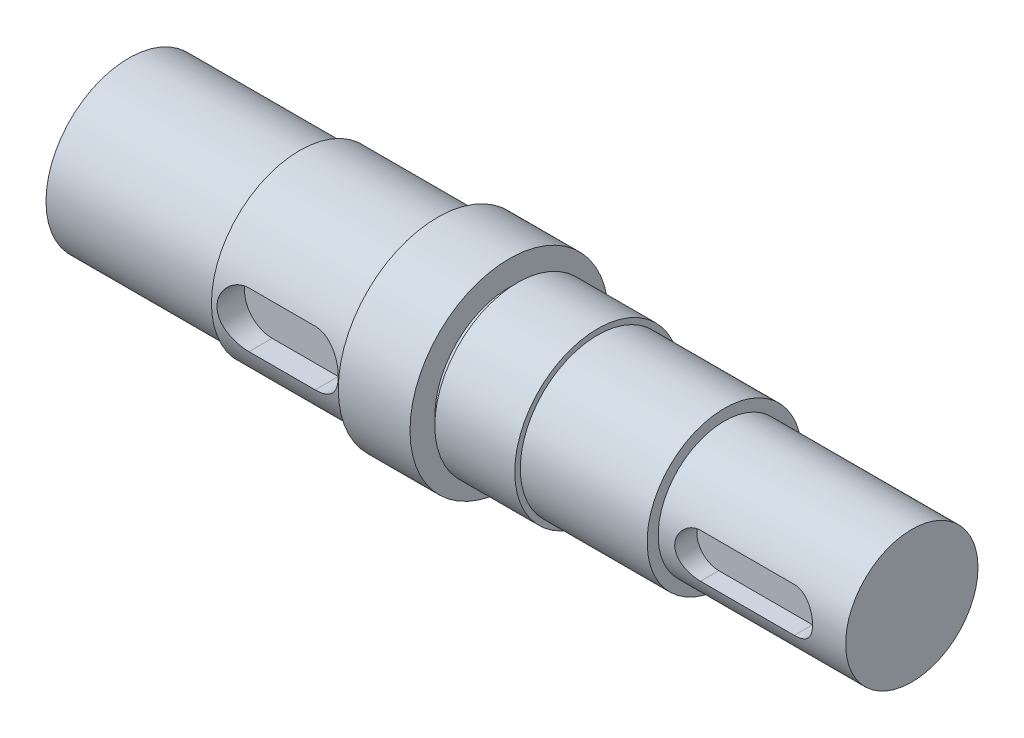
ISO-10303-21;
HEADER;
FILE_DESCRIPTION(('STEP AP214'),'2;1');
FILE_NAME('part.step','',(''),(''),'','','');
FILE_SCHEMA(('AUTOMOTIVE_DESIGN { 1 0 10303 214 1 1 1 1 }'));
ENDSEC;
DATA;
#1=APPLICATION_CONTEXT('core data for automotive mechanical design processes');
#2=APPLICATION_PROTOCOL_DEFINITION('international standard','automotive_design',2000,#1);
#3=PRODUCT_CONTEXT('',#1,'mechanical');
#4=PRODUCT('Part','Part','',(#3));
#5=PRODUCT_RELATED_PRODUCT_CATEGORY('part','',(#4));
#6=PRODUCT_DEFINITION_FORMATION('','',#4);
#7=PRODUCT_DEFINITION_CONTEXT('part definition',#1,'design');
#8=PRODUCT_DEFINITION('design','',#6,#7);
#9=PRODUCT_DEFINITION_SHAPE('','',#8);
#10=(LENGTH_UNIT() NAMED_UNIT(*) SI_UNIT(.MILLI.,.METRE.));
#11=(NAMED_UNIT(*) PLANE_ANGLE_UNIT() SI_UNIT($,.RADIAN.));
#12=(NAMED_UNIT(*) SI_UNIT($,.STERADIAN.) SOLID_ANGLE_UNIT());
#13=UNCERTAINTY_MEASURE_WITH_UNIT(LENGTH_MEASURE(1.E-05),#10,'distance_accuracy_value','');
#14=(GEOMETRIC_REPRESENTATION_CONTEXT(3) GLOBAL_UNCERTAINTY_ASSIGNED_CONTEXT((#13)) GLOBAL_UNIT_ASSIGNED_CONTEXT((#10,
#11,#12)) REPRESENTATION_CONTEXT('',''));
#15=CARTESIAN_POINT('',(0.,0.,0.));
#16=DIRECTION('',(0.,0.,1.));
#17=DIRECTION('',(1.,0.,0.));
#18=AXIS2_PLACEMENT_3D('',#15,#16,#17);
#19=CARTESIAN_POINT('',(86.,0.,0.));
#20=DIRECTION('',(-1.,0.,0.));
#21=DIRECTION('',(0.,0.,1.));
#22=AXIS2_PLACEMENT_3D('',#19,#20,#21);
#23=CYLINDRICAL_SURFACE('',#22,12.);
#24=CARTESIAN_POINT('',(52.,0.,0.));
#25=DIRECTION('',(1.,0.,0.));
#26=DIRECTION('',(0.,0.,-1.));
#27=AXIS2_PLACEMENT_3D('',#24,#25,#26);
#28=CIRCLE('',#27,12.);
#29=CARTESIAN_POINT('',(52.,0.,-12.));
#30=VERTEX_POINT('',#29);
#31=EDGE_CURVE('E165',#30,#30,#28,.T.);
#32=ORIENTED_EDGE('',*,*,#31,.T.);
#33=EDGE_LOOP('',(#32));
#34=FACE_BOUND('',#33,.T.);
#35=CARTESIAN_POINT('',(86.,0.,0.));
#36=DIRECTION('',(1.,0.,0.));
#37=DIRECTION('',(0.,0.,-1.));
#38=AXIS2_PLACEMENT_3D('',#35,#36,#37);
#39=CIRCLE('',#38,12.);
#40=CARTESIAN_POINT('',(86.,0.,-12.));
#41=VERTEX_POINT('',#40);
#42=EDGE_CURVE('E166',#41,#41,#39,.T.);
#43=ORIENTED_EDGE('',*,*,#42,.F.);
#44=EDGE_LOOP('',(#43));
#45=FACE_BOUND('',#44,.T.);
#46=CARTESIAN_POINT('',(59.,4.,11.3137084989848));
#47=CARTESIAN_POINT('',(58.8908686754875,4.0000143857665,11.3136910923705));
#48=CARTESIAN_POINT('',(58.7817470805194,3.99553419554536,11.3152871024731));
#49=CARTESIAN_POINT('',(58.5643503386412,3.97769673248752,11.3215763859361));
#50=CARTESIAN_POINT('',(58.4560749712191,3.96434185595522,11.3262688232103));
#51=CARTESIAN_POINT('',(58.2414552186327,3.92891935076474,11.3386032840401));
#52=CARTESIAN_POINT('',(58.1351060759185,3.90687756421021,11.3462365576019));
#53=CARTESIAN_POINT('',(57.9247867702676,3.85430689648188,11.364201918496));
#54=CARTESIAN_POINT('',(57.8208166934565,3.82377770857634,11.3745341033652));
#55=CARTESIAN_POINT('',(57.5136614724559,3.71986482089948,11.4091190527027));
#56=CARTESIAN_POINT('',(57.314913348044,3.63410266896587,11.4369799021453));
#57=CARTESIAN_POINT('',(56.9345971016626,3.4322845456982,11.4991525453998));
#58=CARTESIAN_POINT('',(56.753039622767,3.31620997228937,11.5334682968154));
#59=CARTESIAN_POINT('',(56.4051313544309,3.05220793355649,11.6061789182336));
#60=CARTESIAN_POINT('',(56.2395437715106,2.90330055412141,11.6446750308563));
#61=CARTESIAN_POINT('',(55.9351726348864,2.57995313902011,11.7205540276094));
#62=CARTESIAN_POINT('',(55.796393854115,2.40550856651356,11.7579367125094));
#63=CARTESIAN_POINT('',(55.5460828409488,2.03041476001126,11.8285552975691));
#64=CARTESIAN_POINT('',(55.4353563067388,1.82920040495823,11.8616574966305));
#65=CARTESIAN_POINT('',(55.2496307489778,1.40971695235372,11.9187843500282));
#66=CARTESIAN_POINT('',(55.1746208113806,1.19145308844236,11.9428117769099));
#67=CARTESIAN_POINT('',(55.0650571548385,0.752117395358864,11.9783628445804));
#68=CARTESIAN_POINT('',(55.0291869149082,0.531407346429906,11.9902923605184));
#69=CARTESIAN_POINT('',(54.9947348007759,0.0867958692352798,12.0017443351774));
#70=CARTESIAN_POINT('',(54.9961440416126,-0.137104785886815,12.0012697502156));
#71=CARTESIAN_POINT('',(55.0353770952526,-0.572415361032316,11.9882415502496));
#72=CARTESIAN_POINT('',(55.0717704013304,-0.783970739663755,11.9761624577266));
#73=CARTESIAN_POINT('',(55.1775729452123,-1.19777632834894,11.9418784019559));
#74=CARTESIAN_POINT('',(55.2469840137269,-1.4000260217555,11.9196728772387));
#75=CARTESIAN_POINT('',(55.4176849060704,-1.79261022537109,11.8670267992102));
#76=CARTESIAN_POINT('',(55.5193820306061,-1.98275302130578,11.8364817702071));
#77=CARTESIAN_POINT('',(55.7514419560314,-2.34369935797278,11.7703352504572));
#78=CARTESIAN_POINT('',(55.8818125545877,-2.51449761883744,11.7347323851811));
#79=CARTESIAN_POINT('',(56.1746757921844,-2.84038544309998,11.6602518814889));
#80=CARTESIAN_POINT('',(56.3383901102989,-2.99435951335509,11.6212989752184));
#81=CARTESIAN_POINT('',(56.6897980333458,-3.27310303719343,11.5458957896576));
#82=CARTESIAN_POINT('',(56.8774993549996,-3.39786305574725,11.5094463215614));
#83=CARTESIAN_POINT('',(57.1747129503772,-3.56109757745215,11.4595759659792));
#84=CARTESIAN_POINT('',(57.2772554047675,-3.61182358389815,11.4436484943195));
#85=CARTESIAN_POINT('',(57.4865649809563,-3.70440095621128,11.4140167075143));
#86=CARTESIAN_POINT('',(57.5933303220756,-3.74625601636389,11.4003114674865));
#87=CARTESIAN_POINT('',(57.8102170865665,-3.82067426911565,11.3755873303494));
#88=CARTESIAN_POINT('',(57.9203347131041,-3.85324757051517,11.3645655126344));
#89=CARTESIAN_POINT('',(58.1431681544474,-3.90883841588792,11.3455648512893));
#90=CARTESIAN_POINT('',(58.2558827579618,-3.93186032329112,11.3375846182867));
#91=CARTESIAN_POINT('',(58.4736424465508,-3.96661962949784,11.3254693235584));
#92=CARTESIAN_POINT('',(58.5785495195786,-3.97913375141091,11.3210705251979));
#93=CARTESIAN_POINT('',(58.7889683326998,-3.99582494949883,11.3151843303776));
#94=CARTESIAN_POINT('',(58.8944791156679,-4.00001278362333,11.3136931771535));
#95=CARTESIAN_POINT('',(59.,-4.,11.3137084989848));
#96=B_SPLINE_CURVE_WITH_KNOTS('',3,(#46,#47,#48,#49,#50,#51,#52,#53,#54,#55,#56,#57,#58,#59,#60,
#61,#62,#63,#64,#65,#66,#67,#68,#69,#70,#71,#72,#73,#74,#75,#76,#77,#78,#79,#80,#81,#82,#83,#84,
#85,#86,#87,#88,#89,#90,#91,#92,#93,#94,#95),.UNSPECIFIED.,.F.,.F.,(4,2,2,2,2,2,2,2,2,2,2,2,2,2,
2,2,2,2,2,2,2,2,2,2,4),(0.,0.327273938941727,0.654459544677845,0.980679087086525,
1.30691042048862,1.95841627077207,2.61032287944837,3.28524582541423,3.96028882145702,
4.65295094423118,5.34540127175222,6.01376445600324,6.68196834813282,7.32396236553653,
7.96599198323704,8.61646637994584,9.26711789045787,9.94834778922914,10.6297973968768,
10.9759539762202,11.3219661149517,11.6675999574416,12.0130757272824,12.3299368411189,
12.6463882889711),.UNSPECIFIED.);
#97=CARTESIAN_POINT('',(59.,4.,11.3137084989848));
#98=VERTEX_POINT('',#97);
#99=CARTESIAN_POINT('',(59.,-4.,11.3137084989848));
#100=VERTEX_POINT('',#99);
#101=EDGE_CURVE('E11',#98,#100,#96,.T.);
#102=ORIENTED_EDGE('',*,*,#101,.F.);
#103=DIRECTION('',(-1.,0.,0.));
#104=VECTOR('',#103,1.);
#105=CARTESIAN_POINT('',(86.,4.,11.3137084989848));
#106=LINE('',#105,#104);
#107=CARTESIAN_POINT('',(76.,4.,11.3137084989848));
#108=VERTEX_POINT('',#107);
#109=EDGE_CURVE('E239',#108,#98,#106,.T.);
#110=ORIENTED_EDGE('',*,*,#109,.F.);
#111=CARTESIAN_POINT('',(76.,-4.,11.3137084989848));
#112=CARTESIAN_POINT('',(76.1091313245125,-4.0000143857665,11.3136910923705));
#113=CARTESIAN_POINT('',(76.2182529194806,-3.99553419554536,11.3152871024731));
#114=CARTESIAN_POINT('',(76.4356496613588,-3.97769673248752,11.3215763859361));
#115=CARTESIAN_POINT('',(76.5439250287808,-3.96434185595522,11.3262688232103));
#116=CARTESIAN_POINT('',(76.7585447813673,-3.92891935076474,11.3386032840401));
#117=CARTESIAN_POINT('',(76.8648939240815,-3.90687756421021,11.3462365576019));
#118=CARTESIAN_POINT('',(77.0752132297324,-3.85430689648187,11.364201918496));
#119=CARTESIAN_POINT('',(77.1791833065435,-3.82377770857634,11.3745341033652));
#120=CARTESIAN_POINT('',(77.4863385275441,-3.71986482089947,11.4091190527027));
#121=CARTESIAN_POINT('',(77.685086651956,-3.63410266896586,11.4369799021453));
#122=CARTESIAN_POINT('',(78.0654028983374,-3.43228454569819,11.4991525453998));
#123=CARTESIAN_POINT('',(78.246960377233,-3.31620997228935,11.5334682968154));
#124=CARTESIAN_POINT('',(78.5948686455692,-3.05220793355648,11.6061789182336));
#125=CARTESIAN_POINT('',(78.7604562284894,-2.9033005541214,11.6446750308563));
#126=CARTESIAN_POINT('',(79.0648273651136,-2.5799531390201,11.7205540276094));
#127=CARTESIAN_POINT('',(79.203606145885,-2.40550856651356,11.7579367125094));
#128=CARTESIAN_POINT('',(79.4539171590512,-2.03041476001125,11.8285552975691));
#129=CARTESIAN_POINT('',(79.5646436932612,-1.82920040495822,11.8616574966305));
#130=CARTESIAN_POINT('',(79.7503692510222,-1.40971695235371,11.9187843500282));
#131=CARTESIAN_POINT('',(79.8253791886194,-1.19145308844234,11.9428117769099));
#132=CARTESIAN_POINT('',(79.9349428451614,-0.752117395358854,11.9783628445804));
#133=CARTESIAN_POINT('',(79.9708130850918,-0.531407346429896,11.9902923605184));
#134=CARTESIAN_POINT('',(80.0052651992241,-0.0867958692352709,12.0017443351774));
#135=CARTESIAN_POINT('',(80.0038559583873,0.137104785886824,12.0012697502156));
#136=CARTESIAN_POINT('',(79.9646229047474,0.572415361032324,11.9882415502496));
#137=CARTESIAN_POINT('',(79.9282295986696,0.783970739663763,11.9761624577266));
#138=CARTESIAN_POINT('',(79.8224270547877,1.19777632834895,11.9418784019559));
#139=CARTESIAN_POINT('',(79.7530159862731,1.40002602175551,11.9196728772387));
#140=CARTESIAN_POINT('',(79.5823150939296,1.79261022537109,11.8670267992102));
#141=CARTESIAN_POINT('',(79.4806179693939,1.98275302130578,11.8364817702071));
#142=CARTESIAN_POINT('',(79.2485580439686,2.34369935797279,11.7703352504572));
#143=CARTESIAN_POINT('',(79.1181874454123,2.51449761883745,11.7347323851811));
#144=CARTESIAN_POINT('',(78.8253242078155,2.84038544309998,11.6602518814889));
#145=CARTESIAN_POINT('',(78.6616098897011,2.99435951335509,11.6212989752184));
#146=CARTESIAN_POINT('',(78.3102019666542,3.27310303719343,11.5458957896576));
#147=CARTESIAN_POINT('',(78.1225006450003,3.39786305574725,11.5094463215614));
#148=CARTESIAN_POINT('',(77.8252870496228,3.56109757745215,11.4595759659792));
#149=CARTESIAN_POINT('',(77.7227445952325,3.61182358389815,11.4436484943195));
#150=CARTESIAN_POINT('',(77.5134350190437,3.70440095621128,11.4140167075143));
#151=CARTESIAN_POINT('',(77.4066696779244,3.74625601636389,11.4003114674865));
#152=CARTESIAN_POINT('',(77.1897829134335,3.82067426911565,11.3755873303494));
#153=CARTESIAN_POINT('',(77.0796652868959,3.85324757051516,11.3645655126344));
#154=CARTESIAN_POINT('',(76.8568318455526,3.90883841588792,11.3455648512893));
#155=CARTESIAN_POINT('',(76.7441172420382,3.93186032329112,11.3375846182867));
#156=CARTESIAN_POINT('',(76.5263575534492,3.96661962949784,11.3254693235584));
#157=CARTESIAN_POINT('',(76.4214504804214,3.97913375141091,11.3210705251979));
#158=CARTESIAN_POINT('',(76.2110316673002,3.99582494949883,11.3151843303776));
#159=CARTESIAN_POINT('',(76.1055208843321,4.00001278362333,11.3136931771535));
#160=CARTESIAN_POINT('',(76.,4.,11.3137084989848));
#161=B_SPLINE_CURVE_WITH_KNOTS('',3,(#111,#112,#113,#114,#115,#116,#117,#118,#119,#120,#121,
#122,#123,#124,#125,#126,#127,#128,#129,#130,#131,#132,#133,#134,#135,#136,#137,#138,#139,#140,
#141,#142,#143,#144,#145,#146,#147,#148,#149,#150,#151,#152,#153,#154,#155,#156,#157,#158,#159,
#160),.UNSPECIFIED.,.F.,.F.,(4,2,2,2,2,2,2,2,2,2,2,2,2,2,2,2,2,2,2,2,2,2,2,2,4),(0.,
0.32727393894172,0.654459544677838,0.980679087086525,1.30691042048863,1.95841627077211,
2.61032287944839,3.28524582541424,3.96028882145703,4.65295094423119,5.34540127175223,
6.01376445600326,6.68196834813283,7.32396236553654,7.96599198323705,8.61646637994584,
9.26711789045789,9.94834778922914,10.6297973968768,10.9759539762202,11.3219661149517,
11.6675999574416,12.0130757272824,12.3299368411189,12.6463882889711),.UNSPECIFIED.);
#162=CARTESIAN_POINT('',(76.,-4.,11.3137084989848));
#163=VERTEX_POINT('',#162);
#164=EDGE_CURVE('E241',#163,#108,#161,.T.);
#165=ORIENTED_EDGE('',*,*,#164,.F.);
#166=DIRECTION('',(-1.,0.,0.));
#167=VECTOR('',#166,1.);
#168=CARTESIAN_POINT('',(86.,-4.,11.3137084989848));
#169=LINE('',#168,#167);
#170=EDGE_CURVE('E50',#100,#163,#169,.F.);
#171=ORIENTED_EDGE('',*,*,#170,.F.);
#172=EDGE_LOOP('',(#102,#110,#165,#171));
#173=FACE_BOUND('',#172,.T.);
#174=ADVANCED_FACE('F36',(#34,#45,#173),#23,.T.);
#175=CARTESIAN_POINT('',(-25.,0.,0.));
#176=DIRECTION('',(1.,0.,0.));
#177=DIRECTION('',(0.,0.,-1.));
#178=AXIS2_PLACEMENT_3D('',#175,#176,#177);
#179=CYLINDRICAL_SURFACE('',#178,16.);
#180=CARTESIAN_POINT('',(0.,0.,0.));
#181=DIRECTION('',(1.,0.,0.));
#182=DIRECTION('',(0.,0.,-1.));
#183=AXIS2_PLACEMENT_3D('',#180,#181,#182);
#184=CIRCLE('',#183,16.);
#185=CARTESIAN_POINT('',(0.,0.,-16.));
#186=VERTEX_POINT('',#185);
#187=EDGE_CURVE('E193',#186,#186,#184,.F.);
#188=ORIENTED_EDGE('',*,*,#187,.T.);
#189=EDGE_LOOP('',(#188));
#190=FACE_BOUND('',#189,.T.);
#191=CARTESIAN_POINT('',(-25.,0.,0.));
#192=DIRECTION('',(-1.,0.,0.));
#193=DIRECTION('',(0.,0.,1.));
#194=AXIS2_PLACEMENT_3D('',#191,#192,#193);
#195=CIRCLE('',#194,16.);
#196=CARTESIAN_POINT('',(-25.,0.,16.));
#197=VERTEX_POINT('',#196);
#198=EDGE_CURVE('E160',#197,#197,#195,.T.);
#199=ORIENTED_EDGE('',*,*,#198,.F.);
#200=EDGE_LOOP('',(#199));
#201=FACE_BOUND('',#200,.T.);
#202=CARTESIAN_POINT('',(-19.,5.,15.1986841535707));
#203=CARTESIAN_POINT('',(-19.1369297177379,5.00001876402018,15.1986635060155));
#204=CARTESIAN_POINT('',(-19.2738515786107,4.99437589347759,15.2005339376472));
#205=CARTESIAN_POINT('',(-19.5466441616812,4.9719066012981,15.2079058985265));
#206=CARTESIAN_POINT('',(-19.6825151292311,4.95508287500206,15.2134065526432));
#207=CARTESIAN_POINT('',(-19.9518756253299,4.91045141983464,15.2278686056186));
#208=CARTESIAN_POINT('',(-20.0853705652593,4.88267328245065,15.2368206796073));
#209=CARTESIAN_POINT('',(-20.3494121913658,4.81639022533697,15.2579029145887));
#210=CARTESIAN_POINT('',(-20.479958789781,4.77788498675236,15.2700331700498));
#211=CARTESIAN_POINT('',(-20.7371387356005,4.69049837729811,15.2971014107057));
#212=CARTESIAN_POINT('',(-20.8637746349516,4.64162394412445,15.3120375178334));
#213=CARTESIAN_POINT('',(-21.1124230254503,4.5338788859812,15.3442856115609));
#214=CARTESIAN_POINT('',(-21.2344337738436,4.47500453795589,15.3615984825888));
#215=CARTESIAN_POINT('',(-21.5923890679799,4.28398711580932,15.4163884767029));
#216=CARTESIAN_POINT('',(-21.8203916857905,4.13740351463561,15.4567319869187));
#217=CARTESIAN_POINT('',(-22.2559520827829,3.80477014396878,15.5420083062615));
#218=CARTESIAN_POINT('',(-22.4626585082763,3.61763914961478,15.5870445200358));
#219=CARTESIAN_POINT('',(-22.8423676526895,3.21145982301367,15.6757673694125));
#220=CARTESIAN_POINT('',(-23.0153645727234,2.99240601054464,15.7194537717275));
#221=CARTESIAN_POINT('',(-23.3264503978222,2.52249761762138,15.8017432610087));
#222=CARTESIAN_POINT('',(-23.4636611267965,2.27103576512448,15.8402090039263));
#223=CARTESIAN_POINT('',(-23.6935071381779,1.74720631304676,15.9065031203034));
#224=CARTESIAN_POINT('',(-23.7861546815474,1.47484448775402,15.9343344192537));
#225=CARTESIAN_POINT('',(-23.921404023007,0.925860089211046,15.9754868433124));
#226=CARTESIAN_POINT('',(-23.9654621090382,0.649628435012772,15.989229278753));
#227=CARTESIAN_POINT('',(-24.0068974314688,0.0933690149137154,16.0021438524195));
#228=CARTESIAN_POINT('',(-24.0042843325814,-0.186657953048529,16.0013190072522));
#229=CARTESIAN_POINT('',(-23.9534065239998,-0.732299589546384,15.9854845726588));
#230=CARTESIAN_POINT('',(-23.9067212697878,-0.998078033880907,15.9709657627342));
#231=CARTESIAN_POINT('',(-23.7716196828297,-1.51781473163231,15.9299791073477));
#232=CARTESIAN_POINT('',(-23.6832011065195,-1.77177234876053,15.90351061948));
#233=CARTESIAN_POINT('',(-23.4661161738423,-2.26431537219272,15.8409378140145));
#234=CARTESIAN_POINT('',(-23.3369700371082,-2.50267435181536,15.8047194262738));
#235=CARTESIAN_POINT('',(-23.0425232216915,-2.95480608942299,15.7264700104951));
#236=CARTESIAN_POINT('',(-22.8772137804566,-3.16857286940456,15.6844375745929));
#237=CARTESIAN_POINT('',(-22.5068863322796,-3.57495597883695,15.5969449434458));
#238=CARTESIAN_POINT('',(-22.3005029256289,-3.76632311133059,15.5514148920094));
#239=CARTESIAN_POINT('',(-21.9689743734189,-4.02553989626261,15.4855747041344));
#240=CARTESIAN_POINT('',(-21.8547196773283,-4.10735324144972,15.464023127535));
#241=CARTESIAN_POINT('',(-21.6195614218216,-4.2611738972957,15.4223452821405));
#242=CARTESIAN_POINT('',(-21.4986604849244,-4.33318503733556,15.4022184582275));
#243=CARTESIAN_POINT('',(-21.249466774637,-4.46768370741089,15.3637482945825));
#244=CARTESIAN_POINT('',(-21.1211019815447,-4.53004475183006,15.3454296242414));
#245=CARTESIAN_POINT('',(-20.8592633981691,-4.64365087484838,15.3114343470153));
#246=CARTESIAN_POINT('',(-20.7257917379939,-4.69490052987992,15.2957566529907));
#247=CARTESIAN_POINT('',(-20.4547920818445,-4.78581076137362,15.2675565411669));
#248=CARTESIAN_POINT('',(-20.3172685736427,-4.82548366541209,15.2550307689955));
#249=CARTESIAN_POINT('',(-20.039118633416,-4.89292357731496,15.2335336556112));
#250=CARTESIAN_POINT('',(-19.8984936584496,-4.92069605575214,15.2245606813372));
#251=CARTESIAN_POINT('',(-19.6316869336986,-4.96155201839676,15.2112927618778));
#252=CARTESIAN_POINT('',(-19.5057286808262,-4.97596872830392,15.2065749583153));
#253=CARTESIAN_POINT('',(-19.2531834848566,-4.9951923004764,15.2002655216957));
#254=CARTESIAN_POINT('',(-19.1265976837225,-5.00001273345967,15.1986694740171));
#255=CARTESIAN_POINT('',(-19.,-5.,15.1986841535707));
#256=B_SPLINE_CURVE_WITH_KNOTS('',3,(#202,#203,#204,#205,#206,#207,#208,#209,#210,#211,#212,
#213,#214,#215,#216,#217,#218,#219,#220,#221,#222,#223,#224,#225,#226,#227,#228,#229,#230,#231,
#232,#233,#234,#235,#236,#237,#238,#239,#240,#241,#242,#243,#244,#245,#246,#247,#248,#249,#250,
#251,#252,#253,#254,#255),.UNSPECIFIED.,.F.,.F.,(4,2,2,2,2,2,2,2,2,2,2,2,2,2,2,2,2,2,2,2,2,2,2,
2,2,2,4),(0.,0.410647919758036,0.821196881542665,1.23064432922751,1.64010394872541,
2.04929047101912,2.45862967230994,3.2768827913103,4.12046514534441,4.96419248897058,
5.82700574327198,6.6895814701031,7.52553600517322,8.36131743199138,9.16823951381226,
9.97520498033131,10.7920560572179,11.609105280929,12.4601312020614,12.8862315051731,
13.3121648650028,13.7432787284905,14.1742146909751,14.6046900798641,15.0349673682784,
15.4151752920152,15.7948451560185),.UNSPECIFIED.);
#257=CARTESIAN_POINT('',(-19.,5.,15.1986841535707));
#258=VERTEX_POINT('',#257);
#259=CARTESIAN_POINT('',(-19.,-5.,15.1986841535707));
#260=VERTEX_POINT('',#259);
#261=EDGE_CURVE('E233',#258,#260,#256,.T.);
#262=ORIENTED_EDGE('',*,*,#261,.F.);
#263=DIRECTION('',(1.,0.,0.));
#264=VECTOR('',#263,1.);
#265=CARTESIAN_POINT('',(-25.,5.,15.1986841535707));
#266=LINE('',#265,#264);
#267=CARTESIAN_POINT('',(-7.,5.,15.1986841535707));
#268=VERTEX_POINT('',#267);
#269=EDGE_CURVE('E198',#268,#258,#266,.F.);
#270=ORIENTED_EDGE('',*,*,#269,.F.);
#271=CARTESIAN_POINT('',(-7.,-5.,15.1986841535707));
#272=CARTESIAN_POINT('',(-6.8630702822621,-5.00001876402018,15.1986635060155));
#273=CARTESIAN_POINT('',(-6.7261484213893,-4.99437589347759,15.2005339376472));
#274=CARTESIAN_POINT('',(-6.45335583831884,-4.9719066012981,15.2079058985265));
#275=CARTESIAN_POINT('',(-6.31748487076893,-4.95508287500206,15.2134065526432));
#276=CARTESIAN_POINT('',(-6.04812437467006,-4.91045141983464,15.2278686056186));
#277=CARTESIAN_POINT('',(-5.91462943474071,-4.88267328245064,15.2368206796073));
#278=CARTESIAN_POINT('',(-5.6505878086342,-4.81639022533697,15.2579029145887));
#279=CARTESIAN_POINT('',(-5.52004121021898,-4.77788498675236,15.2700331700498));
#280=CARTESIAN_POINT('',(-5.26286126439948,-4.69049837729811,15.2971014107057));
#281=CARTESIAN_POINT('',(-5.13622536504842,-4.64162394412445,15.3120375178334));
#282=CARTESIAN_POINT('',(-4.88757697454968,-4.5338788859812,15.3442856115609));
#283=CARTESIAN_POINT('',(-4.76556622615643,-4.47500453795589,15.3615984825888));
#284=CARTESIAN_POINT('',(-4.4076109320201,-4.28398711580932,15.4163884767029));
#285=CARTESIAN_POINT('',(-4.17960831420955,-4.13740351463561,15.4567319869187));
#286=CARTESIAN_POINT('',(-3.74404791721714,-3.80477014396878,15.5420083062615));
#287=CARTESIAN_POINT('',(-3.53734149172373,-3.61763914961478,15.5870445200358));
#288=CARTESIAN_POINT('',(-3.15763234731053,-3.21145982301367,15.6757673694125));
#289=CARTESIAN_POINT('',(-2.98463542727657,-2.99240601054464,15.7194537717275));
#290=CARTESIAN_POINT('',(-2.67354960217775,-2.52249761762139,15.8017432610087));
#291=CARTESIAN_POINT('',(-2.53633887320348,-2.27103576512448,15.8402090039263));
#292=CARTESIAN_POINT('',(-2.30649286182209,-1.74720631304676,15.9065031203034));
#293=CARTESIAN_POINT('',(-2.21384531845258,-1.47484448775402,15.9343344192537));
#294=CARTESIAN_POINT('',(-2.07859597699295,-0.925860089211049,15.9754868433124));
#295=CARTESIAN_POINT('',(-2.03453789096175,-0.649628435012774,15.989229278753));
#296=CARTESIAN_POINT('',(-1.99310256853123,-0.0933690149137173,16.0021438524195));
#297=CARTESIAN_POINT('',(-1.9957156674186,0.186657953048528,16.0013190072522));
#298=CARTESIAN_POINT('',(-2.04659347600016,0.732299589546383,15.9854845726588));
#299=CARTESIAN_POINT('',(-2.09327873021216,0.998078033880907,15.9709657627342));
#300=CARTESIAN_POINT('',(-2.22838031717034,1.51781473163231,15.9299791073477));
#301=CARTESIAN_POINT('',(-2.31679889348055,1.77177234876053,15.90351061948));
#302=CARTESIAN_POINT('',(-2.5338838261577,2.26431537219272,15.8409378140145));
#303=CARTESIAN_POINT('',(-2.66302996289178,2.50267435181536,15.8047194262738));
#304=CARTESIAN_POINT('',(-2.95747677830852,2.95480608942299,15.7264700104951));
#305=CARTESIAN_POINT('',(-3.12278621954343,3.16857286940456,15.6844375745929));
#306=CARTESIAN_POINT('',(-3.49311366772036,3.57495597883695,15.5969449434458));
#307=CARTESIAN_POINT('',(-3.69949707437115,3.76632311133059,15.5514148920094));
#308=CARTESIAN_POINT('',(-4.03102562658113,4.02553989626261,15.4855747041344));
#309=CARTESIAN_POINT('',(-4.14528032267166,4.10735324144972,15.464023127535));
#310=CARTESIAN_POINT('',(-4.38043857817843,4.2611738972957,15.4223452821405));
#311=CARTESIAN_POINT('',(-4.50133951507565,4.33318503733555,15.4022184582275));
#312=CARTESIAN_POINT('',(-4.75053322536304,4.46768370741089,15.3637482945825));
#313=CARTESIAN_POINT('',(-4.87889801845526,4.53004475183006,15.3454296242414));
#314=CARTESIAN_POINT('',(-5.14073660183092,4.64365087484838,15.3114343470153));
#315=CARTESIAN_POINT('',(-5.27420826200614,4.69490052987992,15.2957566529907));
#316=CARTESIAN_POINT('',(-5.54520791815553,4.78581076137361,15.2675565411669));
#317=CARTESIAN_POINT('',(-5.68273142635728,4.82548366541209,15.2550307689955));
#318=CARTESIAN_POINT('',(-5.960881366584,4.89292357731496,15.2335336556112));
#319=CARTESIAN_POINT('',(-6.10150634155039,4.92069605575214,15.2245606813372));
#320=CARTESIAN_POINT('',(-6.36831306630137,4.96155201839676,15.2112927618778));
#321=CARTESIAN_POINT('',(-6.49427131917377,4.97596872830391,15.2065749583153));
#322=CARTESIAN_POINT('',(-6.74681651514341,4.99519230047639,15.2002655216957));
#323=CARTESIAN_POINT('',(-6.87340231627745,5.00001273345967,15.1986694740171));
#324=CARTESIAN_POINT('',(-7.,5.,15.1986841535707));
#325=B_SPLINE_CURVE_WITH_KNOTS('',3,(#271,#272,#273,#274,#275,#276,#277,#278,#279,#280,#281,
#282,#283,#284,#285,#286,#287,#288,#289,#290,#291,#292,#293,#294,#295,#296,#297,#298,#299,#300,
#301,#302,#303,#304,#305,#306,#307,#308,#309,#310,#311,#312,#313,#314,#315,#316,#317,#318,#319,
#320,#321,#322,#323,#324),.UNSPECIFIED.,.F.,.F.,(4,2,2,2,2,2,2,2,2,2,2,2,2,2,2,2,2,2,2,2,2,2,2,
2,2,2,4),(0.,0.410647919758039,0.821196881542666,1.23064432922751,1.64010394872541,
2.04929047101912,2.45862967230994,3.2768827913103,4.12046514534441,4.96419248897058,
5.82700574327198,6.6895814701031,7.52553600517322,8.36131743199138,9.16823951381226,
9.97520498033131,10.7920560572179,11.609105280929,12.4601312020614,12.8862315051731,
13.3121648650028,13.7432787284905,14.1742146909751,14.6046900798641,15.0349673682784,
15.4151752920152,15.7948451560185),.UNSPECIFIED.);
#326=CARTESIAN_POINT('',(-7.,-5.,15.1986841535707));
#327=VERTEX_POINT('',#326);
#328=EDGE_CURVE('E200',#327,#268,#325,.T.);
#329=ORIENTED_EDGE('',*,*,#328,.F.);
#330=DIRECTION('',(1.,0.,0.));
#331=VECTOR('',#330,1.);
#332=CARTESIAN_POINT('',(-25.,-5.,15.1986841535707));
#333=LINE('',#332,#331);
#334=EDGE_CURVE('E208',#260,#327,#333,.T.);
#335=ORIENTED_EDGE('',*,*,#334,.F.);
#336=EDGE_LOOP('',(#262,#270,#329,#335));
#337=FACE_BOUND('',#336,.T.);
#338=ADVANCED_FACE('F210',(#190,#201,#337),#179,.T.);
#339=CARTESIAN_POINT('',(-25.,0.,0.));
#340=DIRECTION('',(-1.,0.,0.));
#341=DIRECTION('',(0.,0.,1.));
#342=AXIS2_PLACEMENT_3D('',#339,#340,#341);
#343=PLANE('',#342);
#344=ORIENTED_EDGE('',*,*,#198,.T.);
#345=EDGE_LOOP('',(#344));
#346=FACE_BOUND('',#345,.T.);
#347=CARTESIAN_POINT('',(-25.,0.,0.));
#348=DIRECTION('',(-1.,0.,0.));
#349=DIRECTION('',(0.,0.,1.));
#350=AXIS2_PLACEMENT_3D('',#347,#348,#349);
#351=CIRCLE('',#350,15.);
#352=CARTESIAN_POINT('',(-25.,0.,15.));
#353=VERTEX_POINT('',#352);
#354=EDGE_CURVE('E156',#353,#353,#351,.T.);
#355=ORIENTED_EDGE('',*,*,#354,.F.);
#356=EDGE_LOOP('',(#355));
#357=FACE_BOUND('',#356,.T.);
#358=ADVANCED_FACE('F271',(#346,#357),#343,.T.);
#359=CARTESIAN_POINT('',(0.,0.,0.));
#360=DIRECTION('',(1.,0.,0.));
#361=DIRECTION('',(0.,0.,-1.));
#362=AXIS2_PLACEMENT_3D('',#359,#360,#361);
#363=PLANE('',#362);
#364=CARTESIAN_POINT('',(0.,0.,0.));
#365=DIRECTION('',(1.,0.,0.));
#366=DIRECTION('',(0.,0.,-1.));
#367=AXIS2_PLACEMENT_3D('',#364,#365,#366);
#368=CIRCLE('',#367,18.);
#369=CARTESIAN_POINT('',(0.,0.,18.));
#370=VERTEX_POINT('',#369);
#371=EDGE_CURVE('E187',#370,#370,#368,.T.);
#372=ORIENTED_EDGE('',*,*,#371,.F.);
#373=EDGE_LOOP('',(#372));
#374=FACE_BOUND('',#373,.T.);
#375=ORIENTED_EDGE('',*,*,#187,.F.);
#376=EDGE_LOOP('',(#375));
#377=FACE_BOUND('',#376,.T.);
#378=ADVANCED_FACE('F443',(#374,#377),#363,.F.);
#379=CARTESIAN_POINT('',(52.,0.,0.));
#380=DIRECTION('',(1.,0.,0.));
#381=DIRECTION('',(0.,0.,-1.));
#382=AXIS2_PLACEMENT_3D('',#379,#380,#381);
#383=PLANE('',#382);
#384=CARTESIAN_POINT('',(52.,0.,0.));
#385=DIRECTION('',(1.,0.,0.));
#386=DIRECTION('',(0.,0.,-1.));
#387=AXIS2_PLACEMENT_3D('',#384,#385,#386);
#388=CIRCLE('',#387,14.);
#389=CARTESIAN_POINT('',(52.,0.,-14.));
#390=VERTEX_POINT('',#389);
#391=EDGE_CURVE('E172',#390,#390,#388,.T.);
#392=ORIENTED_EDGE('',*,*,#391,.T.);
#393=EDGE_LOOP('',(#392));
#394=FACE_BOUND('',#393,.T.);
#395=ORIENTED_EDGE('',*,*,#31,.F.);
#396=EDGE_LOOP('',(#395));
#397=FACE_BOUND('',#396,.T.);
#398=ADVANCED_FACE('F434',(#394,#397),#383,.T.);
#399=CARTESIAN_POINT('',(29.,0.,0.));
#400=DIRECTION('',(1.,0.,0.));
#401=DIRECTION('',(0.,0.,-1.));
#402=AXIS2_PLACEMENT_3D('',#399,#400,#401);
#403=PLANE('',#402);
#404=CARTESIAN_POINT('',(29.,0.,0.));
#405=DIRECTION('',(1.,0.,0.));
#406=DIRECTION('',(0.,0.,-1.));
#407=AXIS2_PLACEMENT_3D('',#404,#405,#406);
#408=CIRCLE('',#407,15.);
#409=CARTESIAN_POINT('',(29.,0.,15.));
#410=VERTEX_POINT('',#409);
#411=EDGE_CURVE('E178',#410,#410,#408,.T.);
#412=ORIENTED_EDGE('',*,*,#411,.T.);
#413=EDGE_LOOP('',(#412));
#414=FACE_BOUND('',#413,.T.);
#415=CARTESIAN_POINT('',(29.,0.,0.));
#416=DIRECTION('',(1.,0.,0.));
#417=DIRECTION('',(0.,0.,-1.));
#418=AXIS2_PLACEMENT_3D('',#415,#416,#417);
#419=CIRCLE('',#418,14.);
#420=CARTESIAN_POINT('',(29.,0.,-14.));
#421=VERTEX_POINT('',#420);
#422=EDGE_CURVE('E169',#421,#421,#419,.T.);
#423=ORIENTED_EDGE('',*,*,#422,.F.);
#424=EDGE_LOOP('',(#423));
#425=FACE_BOUND('',#424,.T.);
#426=ADVANCED_FACE('F425',(#414,#425),#403,.T.);
#427=CARTESIAN_POINT('',(13.,0.,0.));
#428=DIRECTION('',(1.,0.,0.));
#429=DIRECTION('',(0.,0.,-1.));
#430=AXIS2_PLACEMENT_3D('',#427,#428,#429);
#431=PLANE('',#430);
#432=CARTESIAN_POINT('',(13.,0.,0.));
#433=DIRECTION('',(1.,0.,0.));
#434=DIRECTION('',(0.,0.,-1.));
#435=AXIS2_PLACEMENT_3D('',#432,#433,#434);
#436=CIRCLE('',#435,18.);
#437=CARTESIAN_POINT('',(13.,0.,18.));
#438=VERTEX_POINT('',#437);
#439=EDGE_CURVE('E190',#438,#438,#436,.T.);
#440=ORIENTED_EDGE('',*,*,#439,.T.);
#441=EDGE_LOOP('',(#440));
#442=FACE_BOUND('',#441,.T.);
#443=CARTESIAN_POINT('',(13.,0.,0.));
#444=DIRECTION('',(1.,0.,0.));
#445=DIRECTION('',(0.,0.,-1.));
#446=AXIS2_PLACEMENT_3D('',#443,#444,#445);
#447=CIRCLE('',#446,13.5);
#448=CARTESIAN_POINT('',(13.,0.,-13.5));
#449=VERTEX_POINT('',#448);
#450=EDGE_CURVE('E181',#449,#449,#447,.T.);
#451=ORIENTED_EDGE('',*,*,#450,.F.);
#452=EDGE_LOOP('',(#451));
#453=FACE_BOUND('',#452,.T.);
#454=ADVANCED_FACE('F417',(#442,#453),#431,.T.);
#455=CARTESIAN_POINT('',(13.,0.,0.));
#456=DIRECTION('',(-1.,0.,0.));
#457=DIRECTION('',(0.,0.,1.));
#458=AXIS2_PLACEMENT_3D('',#455,#456,#457);
#459=CYLINDRICAL_SURFACE('',#458,18.);
#460=CARTESIAN_POINT('',(13.,0.,18.));
#461=CARTESIAN_POINT('',(12.8645833333333,0.,18.));
#462=CARTESIAN_POINT('',(12.7291666666667,0.,18.));
#463=CARTESIAN_POINT('',(12.4583333333333,0.,18.));
#464=CARTESIAN_POINT('',(12.3229166666667,0.,18.));
#465=CARTESIAN_POINT('',(12.0520833333333,0.,18.));
#466=CARTESIAN_POINT('',(11.9166666666667,0.,18.));
#467=CARTESIAN_POINT('',(11.6458333333333,0.,18.));
#468=CARTESIAN_POINT('',(11.5104166666667,0.,18.));
#469=CARTESIAN_POINT('',(11.2395833333333,0.,18.));
#470=CARTESIAN_POINT('',(11.1041666666667,0.,18.));
#471=CARTESIAN_POINT('',(10.8333333333333,0.,18.));
#472=CARTESIAN_POINT('',(10.6979166666667,0.,18.));
#473=CARTESIAN_POINT('',(10.4270833333333,0.,18.));
#474=CARTESIAN_POINT('',(10.2916666666667,0.,18.));
#475=CARTESIAN_POINT('',(10.0208333333333,0.,18.));
#476=CARTESIAN_POINT('',(9.88541666666667,0.,18.));
#477=CARTESIAN_POINT('',(9.61458333333333,0.,18.));
#478=CARTESIAN_POINT('',(9.47916666666667,0.,18.));
#479=CARTESIAN_POINT('',(9.20833333333333,0.,18.));
#480=CARTESIAN_POINT('',(9.07291666666666,0.,18.));
#481=CARTESIAN_POINT('',(8.80208333333333,0.,18.));
#482=CARTESIAN_POINT('',(8.66666666666667,0.,18.));
#483=CARTESIAN_POINT('',(8.39583333333333,0.,18.));
#484=CARTESIAN_POINT('',(8.26041666666667,0.,18.));
#485=CARTESIAN_POINT('',(7.98958333333333,0.,18.));
#486=CARTESIAN_POINT('',(7.85416666666667,0.,18.));
#487=CARTESIAN_POINT('',(7.58333333333333,0.,18.));
#488=CARTESIAN_POINT('',(7.44791666666667,0.,18.));
#489=CARTESIAN_POINT('',(7.17708333333333,0.,18.));
#490=CARTESIAN_POINT('',(7.04166666666667,0.,18.));
#491=CARTESIAN_POINT('',(6.77083333333333,0.,18.));
#492=CARTESIAN_POINT('',(6.63541666666667,0.,18.));
#493=CARTESIAN_POINT('',(6.36458333333333,0.,18.));
#494=CARTESIAN_POINT('',(6.22916666666667,0.,18.));
#495=CARTESIAN_POINT('',(5.95833333333333,0.,18.));
#496=CARTESIAN_POINT('',(5.82291666666667,0.,18.));
#497=CARTESIAN_POINT('',(5.55208333333333,0.,18.));
#498=CARTESIAN_POINT('',(5.41666666666667,0.,18.));
#499=CARTESIAN_POINT('',(5.14583333333333,0.,18.));
#500=CARTESIAN_POINT('',(5.01041666666667,0.,18.));
#501=CARTESIAN_POINT('',(4.73958333333333,0.,18.));
#502=CARTESIAN_POINT('',(4.60416666666667,0.,18.));
#503=CARTESIAN_POINT('',(4.33333333333333,0.,18.));
#504=CARTESIAN_POINT('',(4.19791666666667,0.,18.));
#505=CARTESIAN_POINT('',(3.92708333333333,0.,18.));
#506=CARTESIAN_POINT('',(3.79166666666667,0.,18.));
#507=CARTESIAN_POINT('',(3.52083333333333,0.,18.));
#508=CARTESIAN_POINT('',(3.38541666666667,0.,18.));
#509=CARTESIAN_POINT('',(3.11458333333333,0.,18.));
#510=CARTESIAN_POINT('',(2.97916666666667,0.,18.));
#511=CARTESIAN_POINT('',(2.70833333333333,0.,18.));
#512=CARTESIAN_POINT('',(2.57291666666667,0.,18.));
#513=CARTESIAN_POINT('',(2.30208333333333,0.,18.));
#514=CARTESIAN_POINT('',(2.16666666666667,0.,18.));
#515=CARTESIAN_POINT('',(1.89583333333333,0.,18.));
#516=CARTESIAN_POINT('',(1.76041666666667,0.,18.));
#517=CARTESIAN_POINT('',(1.48958333333333,0.,18.));
#518=CARTESIAN_POINT('',(1.35416666666667,0.,18.));
#519=CARTESIAN_POINT('',(1.08333333333333,0.,18.));
#520=CARTESIAN_POINT('',(0.947916666666667,0.,18.));
#521=CARTESIAN_POINT('',(0.677083333333334,0.,18.));
#522=CARTESIAN_POINT('',(0.541666666666667,0.,18.));
#523=CARTESIAN_POINT('',(0.270833333333334,0.,18.));
#524=CARTESIAN_POINT('',(0.135416666666667,0.,18.));
#525=CARTESIAN_POINT('',(0.,0.,18.));
#526=B_SPLINE_CURVE_WITH_KNOTS('',3,(#460,#461,#462,#463,#464,#465,#466,#467,#468,#469,#470,
#471,#472,#473,#474,#475,#476,#477,#478,#479,#480,#481,#482,#483,#484,#485,#486,#487,#488,#489,
#490,#491,#492,#493,#494,#495,#496,#497,#498,#499,#500,#501,#502,#503,#504,#505,#506,#507,#508,
#509,#510,#511,#512,#513,#514,#515,#516,#517,#518,#519,#520,#521,#522,#523,#524,#525),
.UNSPECIFIED.,.F.,.F.,(4,2,2,2,2,2,2,2,2,2,2,2,2,2,2,2,2,2,2,2,2,2,2,2,2,2,2,2,2,2,2,2,4),(0.,
0.40625,0.812500000000001,1.21875,1.625,2.03125,2.4375,2.84375,3.25,3.65625,4.0625,4.46875,
4.875,5.28125,5.6875,6.09375,6.5,6.90625,7.3125,7.71875,8.125,8.53125,8.9375,9.34375,9.75,
10.15625,10.5625,10.96875,11.375,11.78125,12.1875,12.59375,13.),.UNSPECIFIED.);
#527=EDGE_CURVE('BSEAM38',#438,#370,#526,.T.);
#528=ORIENTED_EDGE('',*,*,#439,.F.);
#529=ORIENTED_EDGE('',*,*,#371,.T.);
#530=ORIENTED_EDGE('',*,*,#527,.T.);
#531=ORIENTED_EDGE('',*,*,#527,.F.);
#532=EDGE_LOOP('',(#528,#530,#529,#531));
#533=FACE_BOUND('',#532,.T.);
#534=ADVANCED_FACE('F38',(#533),#459,.T.);
#535=CARTESIAN_POINT('',(14.5,0.,0.));
#536=DIRECTION('',(-1.,0.,0.));
#537=DIRECTION('',(0.,0.,1.));
#538=AXIS2_PLACEMENT_3D('',#535,#536,#537);
#539=CYLINDRICAL_SURFACE('',#538,13.5);
#540=CARTESIAN_POINT('',(14.5,0.,0.));
#541=DIRECTION('',(1.,0.,0.));
#542=DIRECTION('',(0.,0.,-1.));
#543=AXIS2_PLACEMENT_3D('',#540,#541,#542);
#544=CIRCLE('',#543,13.5);
#545=CARTESIAN_POINT('',(14.5,0.,-13.5));
#546=VERTEX_POINT('',#545);
#547=EDGE_CURVE('E184',#546,#546,#544,.T.);
#548=ORIENTED_EDGE('',*,*,#547,.F.);
#549=EDGE_LOOP('',(#548));
#550=FACE_BOUND('',#549,.T.);
#551=ORIENTED_EDGE('',*,*,#450,.T.);
#552=EDGE_LOOP('',(#551));
#553=FACE_BOUND('',#552,.T.);
#554=ADVANCED_FACE('F397',(#550,#553),#539,.T.);
#555=CARTESIAN_POINT('',(14.5,0.,0.));
#556=DIRECTION('',(1.,0.,0.));
#557=DIRECTION('',(0.,0.,-1.));
#558=AXIS2_PLACEMENT_3D('',#555,#556,#557);
#559=PLANE('',#558);
#560=CARTESIAN_POINT('',(14.5,0.,0.));
#561=DIRECTION('',(1.,0.,0.));
#562=DIRECTION('',(0.,0.,-1.));
#563=AXIS2_PLACEMENT_3D('',#560,#561,#562);
#564=CIRCLE('',#563,15.);
#565=CARTESIAN_POINT('',(14.5,0.,15.));
#566=VERTEX_POINT('',#565);
#567=EDGE_CURVE('E175',#566,#566,#564,.T.);
#568=ORIENTED_EDGE('',*,*,#567,.F.);
#569=EDGE_LOOP('',(#568));
#570=FACE_BOUND('',#569,.T.);
#571=ORIENTED_EDGE('',*,*,#547,.T.);
#572=EDGE_LOOP('',(#571));
#573=FACE_BOUND('',#572,.T.);
#574=ADVANCED_FACE('F387',(#570,#573),#559,.F.);
#575=CARTESIAN_POINT('',(29.,0.,0.));
#576=DIRECTION('',(-1.,0.,0.));
#577=DIRECTION('',(0.,0.,1.));
#578=AXIS2_PLACEMENT_3D('',#575,#576,#577);
#579=CYLINDRICAL_SURFACE('',#578,15.);
#580=CARTESIAN_POINT('',(29.,0.,15.));
#581=CARTESIAN_POINT('',(28.8489583333333,0.,15.));
#582=CARTESIAN_POINT('',(28.6979166666667,0.,15.));
#583=CARTESIAN_POINT('',(28.3958333333333,0.,15.));
#584=CARTESIAN_POINT('',(28.2447916666667,0.,15.));
#585=CARTESIAN_POINT('',(27.9427083333333,0.,15.));
#586=CARTESIAN_POINT('',(27.7916666666667,0.,15.));
#587=CARTESIAN_POINT('',(27.4895833333333,0.,15.));
#588=CARTESIAN_POINT('',(27.3385416666667,0.,15.));
#589=CARTESIAN_POINT('',(27.0364583333333,0.,15.));
#590=CARTESIAN_POINT('',(26.8854166666667,0.,15.));
#591=CARTESIAN_POINT('',(26.5833333333333,0.,15.));
#592=CARTESIAN_POINT('',(26.4322916666667,0.,15.));
#593=CARTESIAN_POINT('',(26.1302083333333,0.,15.));
#594=CARTESIAN_POINT('',(25.9791666666667,0.,15.));
#595=CARTESIAN_POINT('',(25.6770833333333,0.,15.));
#596=CARTESIAN_POINT('',(25.5260416666667,0.,15.));
#597=CARTESIAN_POINT('',(25.2239583333333,0.,15.));
#598=CARTESIAN_POINT('',(25.0729166666667,0.,15.));
#599=CARTESIAN_POINT('',(24.7708333333333,0.,15.));
#600=CARTESIAN_POINT('',(24.6197916666667,0.,15.));
#601=CARTESIAN_POINT('',(24.3177083333333,0.,15.));
#602=CARTESIAN_POINT('',(24.1666666666667,0.,15.));
#603=CARTESIAN_POINT('',(23.8645833333333,0.,15.));
#604=CARTESIAN_POINT('',(23.7135416666667,0.,15.));
#605=CARTESIAN_POINT('',(23.4114583333333,0.,15.));
#606=CARTESIAN_POINT('',(23.2604166666667,0.,15.));
#607=CARTESIAN_POINT('',(22.9583333333333,0.,15.));
#608=CARTESIAN_POINT('',(22.8072916666667,0.,15.));
#609=CARTESIAN_POINT('',(22.5052083333333,0.,15.));
#610=CARTESIAN_POINT('',(22.3541666666667,0.,15.));
#611=CARTESIAN_POINT('',(22.0520833333333,0.,15.));
#612=CARTESIAN_POINT('',(21.9010416666667,0.,15.));
#613=CARTESIAN_POINT('',(21.5989583333333,0.,15.));
#614=CARTESIAN_POINT('',(21.4479166666667,0.,15.));
#615=CARTESIAN_POINT('',(21.1458333333333,0.,15.));
#616=CARTESIAN_POINT('',(20.9947916666667,0.,15.));
#617=CARTESIAN_POINT('',(20.6927083333333,0.,15.));
#618=CARTESIAN_POINT('',(20.5416666666667,0.,15.));
#619=CARTESIAN_POINT('',(20.2395833333333,0.,15.));
#620=CARTESIAN_POINT('',(20.0885416666667,0.,15.));
#621=CARTESIAN_POINT('',(19.7864583333333,0.,15.));
#622=CARTESIAN_POINT('',(19.6354166666667,0.,15.));
#623=CARTESIAN_POINT('',(19.3333333333333,0.,15.));
#624=CARTESIAN_POINT('',(19.1822916666667,0.,15.));
#625=CARTESIAN_POINT('',(18.8802083333333,0.,15.));
#626=CARTESIAN_POINT('',(18.7291666666667,0.,15.));
#627=CARTESIAN_POINT('',(18.4270833333333,0.,15.));
#628=CARTESIAN_POINT('',(18.2760416666667,0.,15.));
#629=CARTESIAN_POINT('',(17.9739583333333,0.,15.));
#630=CARTESIAN_POINT('',(17.8229166666667,0.,15.));
#631=CARTESIAN_POINT('',(17.5208333333333,0.,15.));
#632=CARTESIAN_POINT('',(17.3697916666667,0.,15.));
#633=CARTESIAN_POINT('',(17.0677083333333,0.,15.));
#634=CARTESIAN_POINT('',(16.9166666666667,0.,15.));
#635=CARTESIAN_POINT('',(16.6145833333333,0.,15.));
#636=CARTESIAN_POINT('',(16.4635416666667,0.,15.));
#637=CARTESIAN_POINT('',(16.1614583333333,0.,15.));
#638=CARTESIAN_POINT('',(16.0104166666667,0.,15.));
#639=CARTESIAN_POINT('',(15.7083333333333,0.,15.));
#640=CARTESIAN_POINT('',(15.5572916666667,0.,15.));
#641=CARTESIAN_POINT('',(15.2552083333333,0.,15.));
#642=CARTESIAN_POINT('',(15.1041666666667,0.,15.));
#643=CARTESIAN_POINT('',(14.8020833333333,0.,15.));
#644=CARTESIAN_POINT('',(14.6510416666667,0.,15.));
#645=CARTESIAN_POINT('',(14.5,0.,15.));
#646=B_SPLINE_CURVE_WITH_KNOTS('',3,(#580,#581,#582,#583,#584,#585,#586,#587,#588,#589,#590,
#591,#592,#593,#594,#595,#596,#597,#598,#599,#600,#601,#602,#603,#604,#605,#606,#607,#608,#609,
#610,#611,#612,#613,#614,#615,#616,#617,#618,#619,#620,#621,#622,#623,#624,#625,#626,#627,#628,
#629,#630,#631,#632,#633,#634,#635,#636,#637,#638,#639,#640,#641,#642,#643,#644,#645),
.UNSPECIFIED.,.F.,.F.,(4,2,2,2,2,2,2,2,2,2,2,2,2,2,2,2,2,2,2,2,2,2,2,2,2,2,2,2,2,2,2,2,4),(0.,
0.453124999999999,0.906249999999997,1.359375,1.8125,2.265625,2.71875,3.171875,3.625,4.078125,
4.53125,4.984375,5.4375,5.890625,6.34375,6.796875,7.25,7.703125,8.15625,8.609375,9.0625,
9.515625,9.96874999999999,10.421875,10.875,11.328125,11.78125,12.234375,12.6875,13.140625,
13.59375,14.046875,14.5),.UNSPECIFIED.);
#647=EDGE_CURVE('BSEAM376',#410,#566,#646,.T.);
#648=ORIENTED_EDGE('',*,*,#411,.F.);
#649=ORIENTED_EDGE('',*,*,#567,.T.);
#650=ORIENTED_EDGE('',*,*,#647,.T.);
#651=ORIENTED_EDGE('',*,*,#647,.F.);
#652=EDGE_LOOP('',(#648,#650,#649,#651));
#653=FACE_BOUND('',#652,.T.);
#654=ADVANCED_FACE('F376',(#653),#579,.T.);
#655=CARTESIAN_POINT('',(52.,0.,0.));
#656=DIRECTION('',(-1.,0.,0.));
#657=DIRECTION('',(0.,0.,1.));
#658=AXIS2_PLACEMENT_3D('',#655,#656,#657);
#659=CYLINDRICAL_SURFACE('',#658,14.);
#660=ORIENTED_EDGE('',*,*,#391,.F.);
#661=EDGE_LOOP('',(#660));
#662=FACE_BOUND('',#661,.T.);
#663=ORIENTED_EDGE('',*,*,#422,.T.);
#664=EDGE_LOOP('',(#663));
#665=FACE_BOUND('',#664,.T.);
#666=ADVANCED_FACE('F365',(#662,#665),#659,.T.);
#667=CARTESIAN_POINT('',(86.,0.,0.));
#668=DIRECTION('',(1.,0.,0.));
#669=DIRECTION('',(0.,0.,-1.));
#670=AXIS2_PLACEMENT_3D('',#667,#668,#669);
#671=PLANE('',#670);
#672=ORIENTED_EDGE('',*,*,#42,.T.);
#673=EDGE_LOOP('',(#672));
#674=FACE_BOUND('',#673,.T.);
#675=ADVANCED_FACE('F355',(#674),#671,.T.);
#676=CARTESIAN_POINT('',(-56.,0.,0.));
#677=DIRECTION('',(1.,0.,0.));
#678=DIRECTION('',(0.,0.,-1.));
#679=AXIS2_PLACEMENT_3D('',#676,#677,#678);
#680=CYLINDRICAL_SURFACE('',#679,15.);
#681=CARTESIAN_POINT('',(-56.,0.,0.));
#682=DIRECTION('',(-1.,0.,0.));
#683=DIRECTION('',(0.,0.,1.));
#684=AXIS2_PLACEMENT_3D('',#681,#682,#683);
#685=CIRCLE('',#684,15.);
#686=CARTESIAN_POINT('',(-56.,0.,15.));
#687=VERTEX_POINT('',#686);
#688=EDGE_CURVE('E157',#687,#687,#685,.T.);
#689=ORIENTED_EDGE('',*,*,#688,.F.);
#690=EDGE_LOOP('',(#689));
#691=FACE_BOUND('',#690,.T.);
#692=ORIENTED_EDGE('',*,*,#354,.T.);
#693=EDGE_LOOP('',(#692));
#694=FACE_BOUND('',#693,.T.);
#695=ADVANCED_FACE('F346',(#691,#694),#680,.T.);
#696=CARTESIAN_POINT('',(-56.,0.,0.));
#697=DIRECTION('',(-1.,0.,0.));
#698=DIRECTION('',(0.,0.,1.));
#699=AXIS2_PLACEMENT_3D('',#696,#697,#698);
#700=PLANE('',#699);
#701=ORIENTED_EDGE('',*,*,#688,.T.);
#702=EDGE_LOOP('',(#701));
#703=FACE_BOUND('',#702,.T.);
#704=ADVANCED_FACE('F230',(#703),#700,.T.);
#705=CARTESIAN_POINT('',(-19.,0.,42.));
#706=DIRECTION('',(0.,0.,-1.));
#707=DIRECTION('',(-1.,0.,0.));
#708=AXIS2_PLACEMENT_3D('',#705,#706,#707);
#709=CYLINDRICAL_SURFACE('',#708,5.);
#710=ORIENTED_EDGE('',*,*,#261,.T.);
#711=DIRECTION('',(0.,0.,-1.));
#712=VECTOR('',#711,1.);
#713=CARTESIAN_POINT('',(-19.,-5.,42.));
#714=LINE('',#713,#712);
#715=CARTESIAN_POINT('',(-19.,-5.,11.));
#716=VERTEX_POINT('',#715);
#717=EDGE_CURVE('E154',#260,#716,#714,.T.);
#718=ORIENTED_EDGE('',*,*,#717,.T.);
#719=CARTESIAN_POINT('',(-19.,0.,11.));
#720=DIRECTION('',(0.,0.,1.));
#721=DIRECTION('',(-1.,0.,0.));
#722=AXIS2_PLACEMENT_3D('',#719,#720,#721);
#723=CIRCLE('',#722,5.);
#724=CARTESIAN_POINT('',(-19.,5.,11.));
#725=VERTEX_POINT('',#724);
#726=EDGE_CURVE('E115',#725,#716,#723,.T.);
#727=ORIENTED_EDGE('',*,*,#726,.F.);
#728=DIRECTION('',(0.,0.,-1.));
#729=VECTOR('',#728,1.);
#730=CARTESIAN_POINT('',(-19.,5.,42.));
#731=LINE('',#730,#729);
#732=EDGE_CURVE('E149',#258,#725,#731,.T.);
#733=ORIENTED_EDGE('',*,*,#732,.F.);
#734=EDGE_LOOP('',(#710,#718,#727,#733));
#735=FACE_BOUND('',#734,.T.);
#736=ADVANCED_FACE('F225',(#735),#709,.F.);
#737=CARTESIAN_POINT('',(-19.,-5.,42.));
#738=DIRECTION('',(0.,1.,0.));
#739=DIRECTION('',(0.,0.,1.));
#740=AXIS2_PLACEMENT_3D('',#737,#738,#739);
#741=PLANE('',#740);
#742=ORIENTED_EDGE('',*,*,#334,.T.);
#743=DIRECTION('',(0.,0.,-1.));
#744=VECTOR('',#743,1.);
#745=CARTESIAN_POINT('',(-7.,-5.,42.));
#746=LINE('',#745,#744);
#747=CARTESIAN_POINT('',(-7.,-5.,11.));
#748=VERTEX_POINT('',#747);
#749=EDGE_CURVE('E152',#327,#748,#746,.T.);
#750=ORIENTED_EDGE('',*,*,#749,.T.);
#751=DIRECTION('',(1.,0.,0.));
#752=VECTOR('',#751,1.);
#753=CARTESIAN_POINT('',(-19.,-5.,11.));
#754=LINE('',#753,#752);
#755=EDGE_CURVE('E140',#716,#748,#754,.T.);
#756=ORIENTED_EDGE('',*,*,#755,.F.);
#757=ORIENTED_EDGE('',*,*,#717,.F.);
#758=EDGE_LOOP('',(#742,#750,#756,#757));
#759=FACE_BOUND('',#758,.T.);
#760=ADVANCED_FACE('F220',(#759),#741,.T.);
#761=CARTESIAN_POINT('',(-7.,0.,42.));
#762=DIRECTION('',(0.,0.,-1.));
#763=DIRECTION('',(-1.,0.,0.));
#764=AXIS2_PLACEMENT_3D('',#761,#762,#763);
#765=CYLINDRICAL_SURFACE('',#764,5.);
#766=ORIENTED_EDGE('',*,*,#328,.T.);
#767=DIRECTION('',(0.,0.,-1.));
#768=VECTOR('',#767,1.);
#769=CARTESIAN_POINT('',(-7.,5.,42.));
#770=LINE('',#769,#768);
#771=CARTESIAN_POINT('',(-7.,5.,11.));
#772=VERTEX_POINT('',#771);
#773=EDGE_CURVE('E65',#268,#772,#770,.T.);
#774=ORIENTED_EDGE('',*,*,#773,.T.);
#775=CARTESIAN_POINT('',(-7.,0.,11.));
#776=DIRECTION('',(0.,0.,1.));
#777=DIRECTION('',(1.,0.,0.));
#778=AXIS2_PLACEMENT_3D('',#775,#776,#777);
#779=CIRCLE('',#778,5.);
#780=EDGE_CURVE('E143',#748,#772,#779,.T.);
#781=ORIENTED_EDGE('',*,*,#780,.F.);
#782=ORIENTED_EDGE('',*,*,#749,.F.);
#783=EDGE_LOOP('',(#766,#774,#781,#782));
#784=FACE_BOUND('',#783,.T.);
#785=ADVANCED_FACE('F214',(#784),#765,.F.);
#786=CARTESIAN_POINT('',(-19.,5.,42.));
#787=DIRECTION('',(0.,-1.,0.));
#788=DIRECTION('',(0.,0.,-1.));
#789=AXIS2_PLACEMENT_3D('',#786,#787,#788);
#790=PLANE('',#789);
#791=ORIENTED_EDGE('',*,*,#269,.T.);
#792=ORIENTED_EDGE('',*,*,#732,.T.);
#793=DIRECTION('',(-1.,0.,0.));
#794=VECTOR('',#793,1.);
#795=CARTESIAN_POINT('',(-19.,5.,11.));
#796=LINE('',#795,#794);
#797=EDGE_CURVE('E146',#772,#725,#796,.T.);
#798=ORIENTED_EDGE('',*,*,#797,.F.);
#799=ORIENTED_EDGE('',*,*,#773,.F.);
#800=EDGE_LOOP('',(#791,#792,#798,#799));
#801=FACE_BOUND('',#800,.T.);
#802=ADVANCED_FACE('F219',(#801),#790,.T.);
#803=CARTESIAN_POINT('',(-19.,0.,11.));
#804=DIRECTION('',(0.,0.,-1.));
#805=DIRECTION('',(-1.,0.,0.));
#806=AXIS2_PLACEMENT_3D('',#803,#804,#805);
#807=PLANE('',#806);
#808=ORIENTED_EDGE('',*,*,#726,.T.);
#809=ORIENTED_EDGE('',*,*,#755,.T.);
#810=ORIENTED_EDGE('',*,*,#780,.T.);
#811=ORIENTED_EDGE('',*,*,#797,.T.);
#812=EDGE_LOOP('',(#808,#809,#810,#811));
#813=FACE_BOUND('',#812,.T.);
#814=ADVANCED_FACE('F260',(#813),#807,.F.);
#815=CARTESIAN_POINT('',(59.,0.,39.));
#816=DIRECTION('',(0.,0.,-1.));
#817=DIRECTION('',(-1.,0.,0.));
#818=AXIS2_PLACEMENT_3D('',#815,#816,#817);
#819=CYLINDRICAL_SURFACE('',#818,4.);
#820=ORIENTED_EDGE('',*,*,#101,.T.);
#821=DIRECTION('',(0.,0.,-1.));
#822=VECTOR('',#821,1.);
#823=CARTESIAN_POINT('',(59.,-4.,39.));
#824=LINE('',#823,#822);
#825=CARTESIAN_POINT('',(59.,-4.,8.));
#826=VERTEX_POINT('',#825);
#827=EDGE_CURVE('E106',#100,#826,#824,.T.);
#828=ORIENTED_EDGE('',*,*,#827,.T.);
#829=CARTESIAN_POINT('',(59.,0.,8.));
#830=DIRECTION('',(0.,0.,1.));
#831=DIRECTION('',(-1.,0.,0.));
#832=AXIS2_PLACEMENT_3D('',#829,#830,#831);
#833=CIRCLE('',#832,4.);
#834=CARTESIAN_POINT('',(59.,4.,8.));
#835=VERTEX_POINT('',#834);
#836=EDGE_CURVE('E111',#835,#826,#833,.T.);
#837=ORIENTED_EDGE('',*,*,#836,.F.);
#838=DIRECTION('',(0.,0.,-1.));
#839=VECTOR('',#838,1.);
#840=CARTESIAN_POINT('',(59.,4.,39.));
#841=LINE('',#840,#839);
#842=EDGE_CURVE('E134',#98,#835,#841,.T.);
#843=ORIENTED_EDGE('',*,*,#842,.F.);
#844=EDGE_LOOP('',(#820,#828,#837,#843));
#845=FACE_BOUND('',#844,.T.);
#846=ADVANCED_FACE('F108',(#845),#819,.F.);
#847=CARTESIAN_POINT('',(59.,-4.,39.));
#848=DIRECTION('',(0.,1.,0.));
#849=DIRECTION('',(0.,0.,1.));
#850=AXIS2_PLACEMENT_3D('',#847,#848,#849);
#851=PLANE('',#850);
#852=ORIENTED_EDGE('',*,*,#170,.T.);
#853=DIRECTION('',(0.,0.,-1.));
#854=VECTOR('',#853,1.);
#855=CARTESIAN_POINT('',(76.,-4.,39.));
#856=LINE('',#855,#854);
#857=CARTESIAN_POINT('',(76.,-4.,8.));
#858=VERTEX_POINT('',#857);
#859=EDGE_CURVE('E116',#163,#858,#856,.T.);
#860=ORIENTED_EDGE('',*,*,#859,.T.);
#861=DIRECTION('',(1.,0.,0.));
#862=VECTOR('',#861,1.);
#863=CARTESIAN_POINT('',(59.,-4.,8.));
#864=LINE('',#863,#862);
#865=EDGE_CURVE('E119',#826,#858,#864,.T.);
#866=ORIENTED_EDGE('',*,*,#865,.F.);
#867=ORIENTED_EDGE('',*,*,#827,.F.);
#868=EDGE_LOOP('',(#852,#860,#866,#867));
#869=FACE_BOUND('',#868,.T.);
#870=ADVANCED_FACE('F120',(#869),#851,.T.);
#871=CARTESIAN_POINT('',(76.,0.,39.));
#872=DIRECTION('',(0.,0.,-1.));
#873=DIRECTION('',(-1.,0.,0.));
#874=AXIS2_PLACEMENT_3D('',#871,#872,#873);
#875=CYLINDRICAL_SURFACE('',#874,4.);
#876=ORIENTED_EDGE('',*,*,#164,.T.);
#877=DIRECTION('',(0.,0.,-1.));
#878=VECTOR('',#877,1.);
#879=CARTESIAN_POINT('',(76.,4.,39.));
#880=LINE('',#879,#878);
#881=CARTESIAN_POINT('',(76.,4.,8.));
#882=VERTEX_POINT('',#881);
#883=EDGE_CURVE('E57',#108,#882,#880,.T.);
#884=ORIENTED_EDGE('',*,*,#883,.T.);
#885=CARTESIAN_POINT('',(76.,0.,8.));
#886=DIRECTION('',(0.,0.,1.));
#887=DIRECTION('',(1.,0.,0.));
#888=AXIS2_PLACEMENT_3D('',#885,#886,#887);
#889=CIRCLE('',#888,4.);
#890=EDGE_CURVE('E125',#858,#882,#889,.T.);
#891=ORIENTED_EDGE('',*,*,#890,.F.);
#892=ORIENTED_EDGE('',*,*,#859,.F.);
#893=EDGE_LOOP('',(#876,#884,#891,#892));
#894=FACE_BOUND('',#893,.T.);
#895=ADVANCED_FACE('F249',(#894),#875,.F.);
#896=CARTESIAN_POINT('',(59.,4.,39.));
#897=DIRECTION('',(0.,-1.,0.));
#898=DIRECTION('',(0.,0.,-1.));
#899=AXIS2_PLACEMENT_3D('',#896,#897,#898);
#900=PLANE('',#899);
#901=ORIENTED_EDGE('',*,*,#109,.T.);
#902=ORIENTED_EDGE('',*,*,#842,.T.);
#903=DIRECTION('',(-1.,0.,0.));
#904=VECTOR('',#903,1.);
#905=CARTESIAN_POINT('',(59.,4.,8.));
#906=LINE('',#905,#904);
#907=EDGE_CURVE('E129',#882,#835,#906,.T.);
#908=ORIENTED_EDGE('',*,*,#907,.F.);
#909=ORIENTED_EDGE('',*,*,#883,.F.);
#910=EDGE_LOOP('',(#901,#902,#908,#909));
#911=FACE_BOUND('',#910,.T.);
#912=ADVANCED_FACE('F254',(#911),#900,.T.);
#913=CARTESIAN_POINT('',(59.,0.,8.));
#914=DIRECTION('',(0.,0.,-1.));
#915=DIRECTION('',(-1.,0.,0.));
#916=AXIS2_PLACEMENT_3D('',#913,#914,#915);
#917=PLANE('',#916);
#918=ORIENTED_EDGE('',*,*,#836,.T.);
#919=ORIENTED_EDGE('',*,*,#865,.T.);
#920=ORIENTED_EDGE('',*,*,#890,.T.);
#921=ORIENTED_EDGE('',*,*,#907,.T.);
#922=EDGE_LOOP('',(#918,#919,#920,#921));
#923=FACE_BOUND('',#922,.T.);
#924=ADVANCED_FACE('F128',(#923),#917,.F.);
#925=CLOSED_SHELL('',(#174,#338,#358,#378,#398,#426,#454,#534,#554,#574,#654,#666,#675,#695,
#704,#736,#760,#785,#802,#814,#846,#870,#895,#912,#924));
#926=MANIFOLD_SOLID_BREP('B2',#925);
#927=ADVANCED_BREP_SHAPE_REPRESENTATION('',(#18,#926),#14);
#928=SHAPE_DEFINITION_REPRESENTATION(#9,#927);
ENDSEC;
END-ISO-10303-21;
